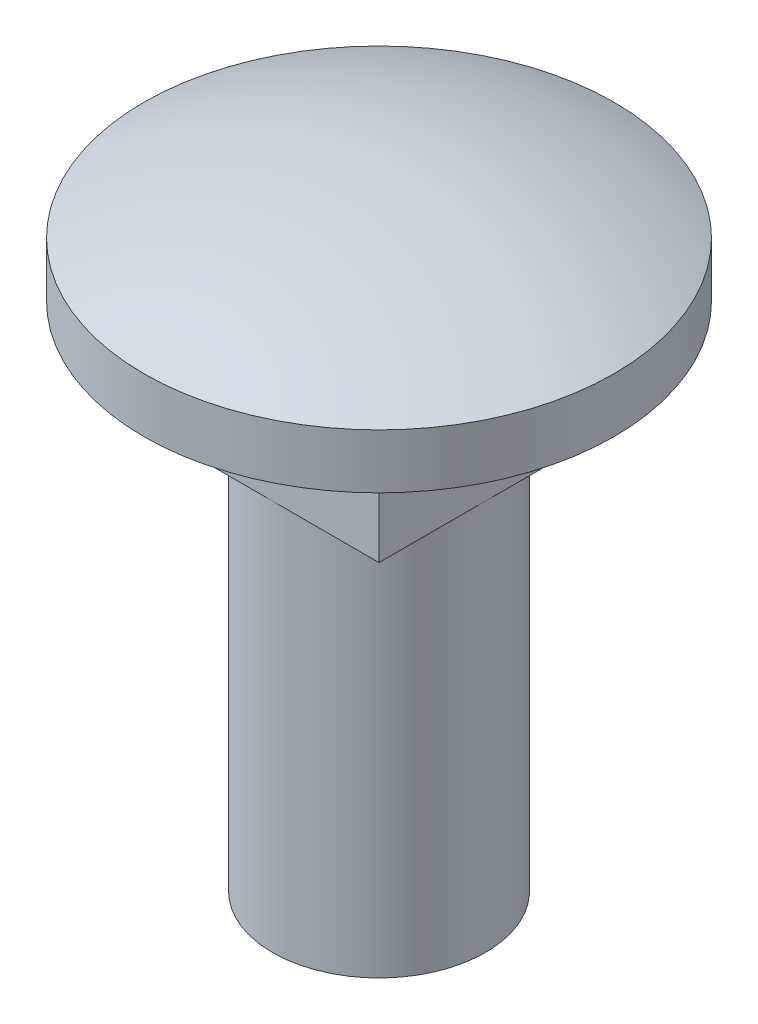
ISO-10303-21;
HEADER;
FILE_DESCRIPTION(('STEP AP214'),'2;1');
FILE_NAME('part.step','',(''),(''),'','','');
FILE_SCHEMA(('AUTOMOTIVE_DESIGN { 1 0 10303 214 1 1 1 1 }'));
ENDSEC;
DATA;
#1=APPLICATION_CONTEXT('core data for automotive mechanical design processes');
#2=APPLICATION_PROTOCOL_DEFINITION('international standard','automotive_design',2000,#1);
#3=PRODUCT_CONTEXT('',#1,'mechanical');
#4=PRODUCT('Part','Part','',(#3));
#5=PRODUCT_RELATED_PRODUCT_CATEGORY('part','',(#4));
#6=PRODUCT_DEFINITION_FORMATION('','',#4);
#7=PRODUCT_DEFINITION_CONTEXT('part definition',#1,'design');
#8=PRODUCT_DEFINITION('design','',#6,#7);
#9=PRODUCT_DEFINITION_SHAPE('','',#8);
#10=(LENGTH_UNIT() NAMED_UNIT(*) SI_UNIT(.MILLI.,.METRE.));
#11=(NAMED_UNIT(*) PLANE_ANGLE_UNIT() SI_UNIT($,.RADIAN.));
#12=(NAMED_UNIT(*) SI_UNIT($,.STERADIAN.) SOLID_ANGLE_UNIT());
#13=UNCERTAINTY_MEASURE_WITH_UNIT(LENGTH_MEASURE(1.E-05),#10,'distance_accuracy_value','');
#14=(GEOMETRIC_REPRESENTATION_CONTEXT(3) GLOBAL_UNCERTAINTY_ASSIGNED_CONTEXT((#13)) GLOBAL_UNIT_ASSIGNED_CONTEXT((#10,
#11,#12)) REPRESENTATION_CONTEXT('',''));
#15=CARTESIAN_POINT('',(0.,0.,0.));
#16=DIRECTION('',(0.,0.,1.));
#17=DIRECTION('',(1.,0.,0.));
#18=AXIS2_PLACEMENT_3D('',#15,#16,#17);
#19=CARTESIAN_POINT('',(3.96875,19.05,0.));
#20=DIRECTION('',(0.,-1.,0.));
#21=DIRECTION('',(0.,0.,-1.));
#22=AXIS2_PLACEMENT_3D('',#19,#20,#21);
#23=PLANE('',#22);
#24=CARTESIAN_POINT('',(0.,19.05,0.));
#25=DIRECTION('',(0.,-1.,0.));
#26=DIRECTION('',(0.,0.,-1.));
#27=AXIS2_PLACEMENT_3D('',#24,#25,#26);
#28=CIRCLE('',#27,8.763);
#29=CARTESIAN_POINT('',(0.,19.05,-8.763));
#30=VERTEX_POINT('',#29);
#31=EDGE_CURVE('E111',#30,#30,#28,.T.);
#32=ORIENTED_EDGE('',*,*,#31,.T.);
#33=EDGE_LOOP('',(#32));
#34=FACE_BOUND('',#33,.T.);
#35=DIRECTION('',(1.,0.,0.));
#36=VECTOR('',#35,1.);
#37=CARTESIAN_POINT('',(-4.0005,19.05,-4.0005));
#38=LINE('',#37,#36);
#39=CARTESIAN_POINT('',(-4.0005,19.05,-4.0005));
#40=VERTEX_POINT('',#39);
#41=CARTESIAN_POINT('',(4.0005,19.05,-4.0005));
#42=VERTEX_POINT('',#41);
#43=EDGE_CURVE('E77',#40,#42,#38,.T.);
#44=ORIENTED_EDGE('',*,*,#43,.F.);
#45=DIRECTION('',(0.,0.,-1.));
#46=VECTOR('',#45,1.);
#47=CARTESIAN_POINT('',(-4.0005,19.05,4.0005));
#48=LINE('',#47,#46);
#49=CARTESIAN_POINT('',(-4.0005,19.05,4.0005));
#50=VERTEX_POINT('',#49);
#51=EDGE_CURVE('E87',#50,#40,#48,.T.);
#52=ORIENTED_EDGE('',*,*,#51,.F.);
#53=DIRECTION('',(-1.,0.,0.));
#54=VECTOR('',#53,1.);
#55=CARTESIAN_POINT('',(-4.0005,19.05,4.0005));
#56=LINE('',#55,#54);
#57=CARTESIAN_POINT('',(4.0005,19.05,4.0005));
#58=VERTEX_POINT('',#57);
#59=EDGE_CURVE('E96',#58,#50,#56,.T.);
#60=ORIENTED_EDGE('',*,*,#59,.F.);
#61=DIRECTION('',(0.,0.,1.));
#62=VECTOR('',#61,1.);
#63=CARTESIAN_POINT('',(4.0005,19.05,4.0005));
#64=LINE('',#63,#62);
#65=EDGE_CURVE('E94',#42,#58,#64,.T.);
#66=ORIENTED_EDGE('',*,*,#65,.F.);
#67=EDGE_LOOP('',(#44,#52,#60,#66));
#68=FACE_BOUND('',#67,.T.);
#69=ADVANCED_FACE('F31',(#34,#68),#23,.T.);
#70=CARTESIAN_POINT('',(0.,0.,0.));
#71=DIRECTION('',(0.,-1.,0.));
#72=DIRECTION('',(0.,0.,-1.));
#73=AXIS2_PLACEMENT_3D('',#70,#71,#72);
#74=CYLINDRICAL_SURFACE('',#73,8.763);
#75=CARTESIAN_POINT('',(0.,21.082,0.));
#76=DIRECTION('',(0.,-1.,0.));
#77=DIRECTION('',(0.,0.,-1.));
#78=AXIS2_PLACEMENT_3D('',#75,#76,#77);
#79=CIRCLE('',#78,8.763);
#80=CARTESIAN_POINT('',(0.,21.082,-8.763));
#81=VERTEX_POINT('',#80);
#82=EDGE_CURVE('E82',#81,#81,#79,.T.);
#83=ORIENTED_EDGE('',*,*,#82,.T.);
#84=EDGE_LOOP('',(#83));
#85=FACE_BOUND('',#84,.T.);
#86=ORIENTED_EDGE('',*,*,#31,.F.);
#87=EDGE_LOOP('',(#86));
#88=FACE_BOUND('',#87,.T.);
#89=ADVANCED_FACE('F127',(#85,#88),#74,.T.);
#90=CARTESIAN_POINT('',(0.,3.20278125,0.));
#91=DIRECTION('',(0.,-1.,0.));
#92=DIRECTION('',(1.,0.,0.));
#93=AXIS2_PLACEMENT_3D('',#90,#91,#92);
#94=SPHERICAL_SURFACE('',#93,19.91121875);
#95=ORIENTED_EDGE('',*,*,#82,.F.);
#96=EDGE_LOOP('',(#95));
#97=FACE_BOUND('',#96,.T.);
#98=ADVANCED_FACE('F132',(#97),#94,.T.);
#99=CARTESIAN_POINT('',(-4.0005,14.605,4.0005));
#100=DIRECTION('',(1.,0.,0.));
#101=DIRECTION('',(0.,0.,-1.));
#102=AXIS2_PLACEMENT_3D('',#99,#100,#101);
#103=PLANE('',#102);
#104=ORIENTED_EDGE('',*,*,#51,.T.);
#105=DIRECTION('',(0.,1.,0.));
#106=VECTOR('',#105,1.);
#107=CARTESIAN_POINT('',(-4.0005,14.605,-4.0005));
#108=LINE('',#107,#106);
#109=CARTESIAN_POINT('',(-4.0005,14.605,-4.0005));
#110=VERTEX_POINT('',#109);
#111=EDGE_CURVE('E72',#110,#40,#108,.T.);
#112=ORIENTED_EDGE('',*,*,#111,.F.);
#113=DIRECTION('',(0.,0.,-1.));
#114=VECTOR('',#113,1.);
#115=CARTESIAN_POINT('',(-4.0005,14.605,4.0005));
#116=LINE('',#115,#114);
#117=CARTESIAN_POINT('',(-4.0005,14.605,4.0005));
#118=VERTEX_POINT('',#117);
#119=EDGE_CURVE('E100',#118,#110,#116,.T.);
#120=ORIENTED_EDGE('',*,*,#119,.F.);
#121=DIRECTION('',(0.,1.,0.));
#122=VECTOR('',#121,1.);
#123=CARTESIAN_POINT('',(-4.0005,14.605,4.0005));
#124=LINE('',#123,#122);
#125=EDGE_CURVE('E89',#118,#50,#124,.T.);
#126=ORIENTED_EDGE('',*,*,#125,.T.);
#127=EDGE_LOOP('',(#104,#112,#120,#126));
#128=FACE_BOUND('',#127,.T.);
#129=ADVANCED_FACE('F88',(#128),#103,.F.);
#130=CARTESIAN_POINT('',(-4.0005,14.605,-4.0005));
#131=DIRECTION('',(0.,0.,1.));
#132=DIRECTION('',(1.,0.,0.));
#133=AXIS2_PLACEMENT_3D('',#130,#131,#132);
#134=PLANE('',#133);
#135=ORIENTED_EDGE('',*,*,#43,.T.);
#136=DIRECTION('',(0.,1.,0.));
#137=VECTOR('',#136,1.);
#138=CARTESIAN_POINT('',(4.0005,14.605,-4.0005));
#139=LINE('',#138,#137);
#140=CARTESIAN_POINT('',(4.0005,14.605,-4.0005));
#141=VERTEX_POINT('',#140);
#142=EDGE_CURVE('E83',#141,#42,#139,.T.);
#143=ORIENTED_EDGE('',*,*,#142,.F.);
#144=DIRECTION('',(1.,0.,0.));
#145=VECTOR('',#144,1.);
#146=CARTESIAN_POINT('',(-4.0005,14.605,-4.0005));
#147=LINE('',#146,#145);
#148=EDGE_CURVE('E79',#110,#141,#147,.T.);
#149=ORIENTED_EDGE('',*,*,#148,.F.);
#150=ORIENTED_EDGE('',*,*,#111,.T.);
#151=EDGE_LOOP('',(#135,#143,#149,#150));
#152=FACE_BOUND('',#151,.T.);
#153=ADVANCED_FACE('F74',(#152),#134,.F.);
#154=CARTESIAN_POINT('',(4.0005,14.605,4.0005));
#155=DIRECTION('',(-1.,0.,0.));
#156=DIRECTION('',(0.,0.,1.));
#157=AXIS2_PLACEMENT_3D('',#154,#155,#156);
#158=PLANE('',#157);
#159=ORIENTED_EDGE('',*,*,#65,.T.);
#160=DIRECTION('',(0.,1.,0.));
#161=VECTOR('',#160,1.);
#162=CARTESIAN_POINT('',(4.0005,14.605,4.0005));
#163=LINE('',#162,#161);
#164=CARTESIAN_POINT('',(4.0005,14.605,4.0005));
#165=VERTEX_POINT('',#164);
#166=EDGE_CURVE('E46',#165,#58,#163,.T.);
#167=ORIENTED_EDGE('',*,*,#166,.F.);
#168=DIRECTION('',(0.,0.,1.));
#169=VECTOR('',#168,1.);
#170=CARTESIAN_POINT('',(4.0005,14.605,4.0005));
#171=LINE('',#170,#169);
#172=EDGE_CURVE('E103',#141,#165,#171,.T.);
#173=ORIENTED_EDGE('',*,*,#172,.F.);
#174=ORIENTED_EDGE('',*,*,#142,.T.);
#175=EDGE_LOOP('',(#159,#167,#173,#174));
#176=FACE_BOUND('',#175,.T.);
#177=ADVANCED_FACE('F143',(#176),#158,.F.);
#178=CARTESIAN_POINT('',(-4.0005,14.605,4.0005));
#179=DIRECTION('',(0.,0.,-1.));
#180=DIRECTION('',(-1.,0.,0.));
#181=AXIS2_PLACEMENT_3D('',#178,#179,#180);
#182=PLANE('',#181);
#183=ORIENTED_EDGE('',*,*,#59,.T.);
#184=ORIENTED_EDGE('',*,*,#125,.F.);
#185=DIRECTION('',(-1.,0.,0.));
#186=VECTOR('',#185,1.);
#187=CARTESIAN_POINT('',(-4.0005,14.605,4.0005));
#188=LINE('',#187,#186);
#189=EDGE_CURVE('E53',#165,#118,#188,.T.);
#190=ORIENTED_EDGE('',*,*,#189,.F.);
#191=ORIENTED_EDGE('',*,*,#166,.T.);
#192=EDGE_LOOP('',(#183,#184,#190,#191));
#193=FACE_BOUND('',#192,.T.);
#194=ADVANCED_FACE('F146',(#193),#182,.F.);
#195=CARTESIAN_POINT('',(-4.0005,14.605,-4.0005));
#196=DIRECTION('',(0.,-1.,0.));
#197=DIRECTION('',(0.,0.,-1.));
#198=AXIS2_PLACEMENT_3D('',#195,#196,#197);
#199=PLANE('',#198);
#200=CARTESIAN_POINT('',(0.,14.605,0.));
#201=DIRECTION('',(0.,-1.,0.));
#202=DIRECTION('',(0.,0.,-1.));
#203=AXIS2_PLACEMENT_3D('',#200,#201,#202);
#204=CIRCLE('',#203,3.96875);
#205=CARTESIAN_POINT('',(0.,14.605,-3.96875));
#206=VERTEX_POINT('',#205);
#207=EDGE_CURVE('E11',#206,#206,#204,.F.);
#208=ORIENTED_EDGE('',*,*,#207,.T.);
#209=EDGE_LOOP('',(#208));
#210=FACE_BOUND('',#209,.T.);
#211=ORIENTED_EDGE('',*,*,#119,.T.);
#212=ORIENTED_EDGE('',*,*,#148,.T.);
#213=ORIENTED_EDGE('',*,*,#172,.T.);
#214=ORIENTED_EDGE('',*,*,#189,.T.);
#215=EDGE_LOOP('',(#211,#212,#213,#214));
#216=FACE_BOUND('',#215,.T.);
#217=ADVANCED_FACE('F123',(#210,#216),#199,.T.);
#218=CARTESIAN_POINT('',(0.,0.,0.));
#219=DIRECTION('',(0.,-1.,0.));
#220=DIRECTION('',(0.,0.,-1.));
#221=AXIS2_PLACEMENT_3D('',#218,#219,#220);
#222=PLANE('',#221);
#223=CARTESIAN_POINT('',(0.,0.,0.));
#224=DIRECTION('',(0.,-1.,0.));
#225=DIRECTION('',(0.,0.,-1.));
#226=AXIS2_PLACEMENT_3D('',#223,#224,#225);
#227=CIRCLE('',#226,3.96875);
#228=CARTESIAN_POINT('',(0.,0.,-3.96875));
#229=VERTEX_POINT('',#228);
#230=EDGE_CURVE('E39',#229,#229,#227,.T.);
#231=ORIENTED_EDGE('',*,*,#230,.T.);
#232=EDGE_LOOP('',(#231));
#233=FACE_BOUND('',#232,.T.);
#234=ADVANCED_FACE('F33',(#233),#222,.T.);
#235=CARTESIAN_POINT('',(0.,0.,0.));
#236=DIRECTION('',(0.,-1.,0.));
#237=DIRECTION('',(0.,0.,-1.));
#238=AXIS2_PLACEMENT_3D('',#235,#236,#237);
#239=CYLINDRICAL_SURFACE('',#238,3.96875);
#240=ORIENTED_EDGE('',*,*,#207,.F.);
#241=EDGE_LOOP('',(#240));
#242=FACE_BOUND('',#241,.T.);
#243=ORIENTED_EDGE('',*,*,#230,.F.);
#244=EDGE_LOOP('',(#243));
#245=FACE_BOUND('',#244,.T.);
#246=ADVANCED_FACE('F117',(#242,#245),#239,.T.);
#247=CLOSED_SHELL('',(#69,#89,#98,#129,#153,#177,#194,#217,#234,#246));
#248=MANIFOLD_SOLID_BREP('B2',#247);
#249=ADVANCED_BREP_SHAPE_REPRESENTATION('',(#18,#248),#14);
#250=SHAPE_DEFINITION_REPRESENTATION(#9,#249);
ENDSEC;
END-ISO-10303-21;
